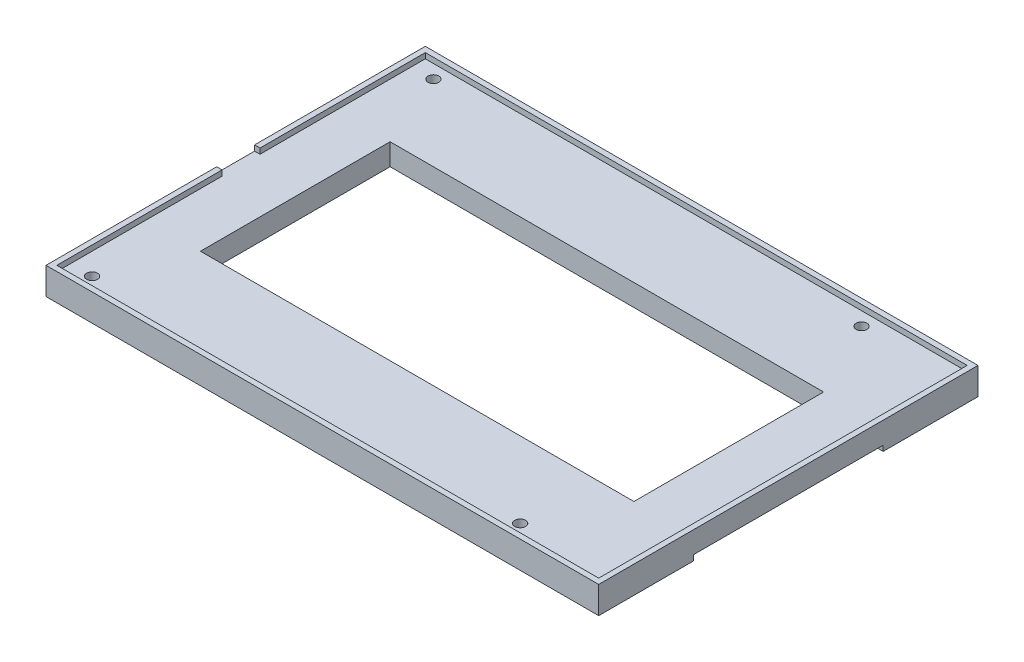
ISO-10303-21;
HEADER;
FILE_DESCRIPTION(('STEP AP214'),'2;1');
FILE_NAME('part.step','',(''),(''),'','','');
FILE_SCHEMA(('AUTOMOTIVE_DESIGN { 1 0 10303 214 1 1 1 1 }'));
ENDSEC;
DATA;
#1=APPLICATION_CONTEXT('core data for automotive mechanical design processes');
#2=APPLICATION_PROTOCOL_DEFINITION('international standard','automotive_design',2000,#1);
#3=PRODUCT_CONTEXT('',#1,'mechanical');
#4=PRODUCT('Part','Part','',(#3));
#5=PRODUCT_RELATED_PRODUCT_CATEGORY('part','',(#4));
#6=PRODUCT_DEFINITION_FORMATION('','',#4);
#7=PRODUCT_DEFINITION_CONTEXT('part definition',#1,'design');
#8=PRODUCT_DEFINITION('design','',#6,#7);
#9=PRODUCT_DEFINITION_SHAPE('','',#8);
#10=(LENGTH_UNIT() NAMED_UNIT(*) SI_UNIT(.MILLI.,.METRE.));
#11=(NAMED_UNIT(*) PLANE_ANGLE_UNIT() SI_UNIT($,.RADIAN.));
#12=(NAMED_UNIT(*) SI_UNIT($,.STERADIAN.) SOLID_ANGLE_UNIT());
#13=UNCERTAINTY_MEASURE_WITH_UNIT(LENGTH_MEASURE(1.E-05),#10,'distance_accuracy_value','');
#14=(GEOMETRIC_REPRESENTATION_CONTEXT(3) GLOBAL_UNCERTAINTY_ASSIGNED_CONTEXT((#13)) GLOBAL_UNIT_ASSIGNED_CONTEXT((#10,
#11,#12)) REPRESENTATION_CONTEXT('',''));
#15=CARTESIAN_POINT('',(0.,0.,0.));
#16=DIRECTION('',(0.,0.,1.));
#17=DIRECTION('',(1.,0.,0.));
#18=AXIS2_PLACEMENT_3D('',#15,#16,#17);
#19=CARTESIAN_POINT('',(40.,5.,17.5));
#20=DIRECTION('',(1.,0.,0.));
#21=DIRECTION('',(0.,0.,-1.));
#22=AXIS2_PLACEMENT_3D('',#19,#20,#21);
#23=PLANE('',#22);
#24=DIRECTION('',(0.,0.,1.));
#25=VECTOR('',#24,1.);
#26=CARTESIAN_POINT('',(40.,4.,17.5));
#27=LINE('',#26,#25);
#28=CARTESIAN_POINT('',(40.,4.,-17.5));
#29=VERTEX_POINT('',#28);
#30=CARTESIAN_POINT('',(40.,4.,17.5));
#31=VERTEX_POINT('',#30);
#32=EDGE_CURVE('E211',#29,#31,#27,.T.);
#33=ORIENTED_EDGE('',*,*,#32,.F.);
#34=DIRECTION('',(0.,-1.,0.));
#35=VECTOR('',#34,1.);
#36=CARTESIAN_POINT('',(40.,5.,-17.5));
#37=LINE('',#36,#35);
#38=CARTESIAN_POINT('',(40.,1.,-17.5));
#39=VERTEX_POINT('',#38);
#40=EDGE_CURVE('E59',#29,#39,#37,.T.);
#41=ORIENTED_EDGE('',*,*,#40,.T.);
#42=DIRECTION('',(0.,0.,-1.));
#43=VECTOR('',#42,1.);
#44=CARTESIAN_POINT('',(40.,1.,17.5));
#45=LINE('',#44,#43);
#46=CARTESIAN_POINT('',(40.,1.,17.5));
#47=VERTEX_POINT('',#46);
#48=EDGE_CURVE('E232',#47,#39,#45,.T.);
#49=ORIENTED_EDGE('',*,*,#48,.F.);
#50=DIRECTION('',(0.,-1.,0.));
#51=VECTOR('',#50,1.);
#52=CARTESIAN_POINT('',(40.,5.,17.5));
#53=LINE('',#52,#51);
#54=EDGE_CURVE('E260',#31,#47,#53,.T.);
#55=ORIENTED_EDGE('',*,*,#54,.F.);
#56=EDGE_LOOP('',(#33,#41,#49,#55));
#57=FACE_BOUND('',#56,.T.);
#58=ADVANCED_FACE('F37',(#57),#23,.F.);
#59=CARTESIAN_POINT('',(-40.,5.,17.5));
#60=DIRECTION('',(-1.,0.,0.));
#61=DIRECTION('',(0.,0.,1.));
#62=AXIS2_PLACEMENT_3D('',#59,#60,#61);
#63=PLANE('',#62);
#64=DIRECTION('',(0.,0.,-1.));
#65=VECTOR('',#64,1.);
#66=CARTESIAN_POINT('',(-40.,4.,17.5));
#67=LINE('',#66,#65);
#68=CARTESIAN_POINT('',(-40.,4.,17.5));
#69=VERTEX_POINT('',#68);
#70=CARTESIAN_POINT('',(-40.,4.,-17.5));
#71=VERTEX_POINT('',#70);
#72=EDGE_CURVE('E51',#69,#71,#67,.T.);
#73=ORIENTED_EDGE('',*,*,#72,.F.);
#74=DIRECTION('',(0.,-1.,0.));
#75=VECTOR('',#74,1.);
#76=CARTESIAN_POINT('',(-40.,5.,17.5));
#77=LINE('',#76,#75);
#78=CARTESIAN_POINT('',(-40.,0.,17.5));
#79=VERTEX_POINT('',#78);
#80=EDGE_CURVE('E257',#69,#79,#77,.T.);
#81=ORIENTED_EDGE('',*,*,#80,.T.);
#82=DIRECTION('',(0.,0.,-1.));
#83=VECTOR('',#82,1.);
#84=CARTESIAN_POINT('',(-40.,0.,17.5));
#85=LINE('',#84,#83);
#86=CARTESIAN_POINT('',(-40.,0.,-17.5));
#87=VERTEX_POINT('',#86);
#88=EDGE_CURVE('E246',#79,#87,#85,.T.);
#89=ORIENTED_EDGE('',*,*,#88,.T.);
#90=DIRECTION('',(0.,-1.,0.));
#91=VECTOR('',#90,1.);
#92=CARTESIAN_POINT('',(-40.,5.,-17.5));
#93=LINE('',#92,#91);
#94=EDGE_CURVE('E256',#71,#87,#93,.T.);
#95=ORIENTED_EDGE('',*,*,#94,.F.);
#96=EDGE_LOOP('',(#73,#81,#89,#95));
#97=FACE_BOUND('',#96,.T.);
#98=ADVANCED_FACE('F376',(#97),#63,.F.);
#99=CARTESIAN_POINT('',(-40.,5.,17.5));
#100=DIRECTION('',(0.,0.,1.));
#101=DIRECTION('',(1.,0.,0.));
#102=AXIS2_PLACEMENT_3D('',#99,#100,#101);
#103=PLANE('',#102);
#104=DIRECTION('',(-1.,0.,0.));
#105=VECTOR('',#104,1.);
#106=CARTESIAN_POINT('',(-40.,4.,17.5));
#107=LINE('',#106,#105);
#108=EDGE_CURVE('E213',#31,#69,#107,.T.);
#109=ORIENTED_EDGE('',*,*,#108,.F.);
#110=ORIENTED_EDGE('',*,*,#54,.T.);
#111=DIRECTION('',(-1.,0.,0.));
#112=VECTOR('',#111,1.);
#113=CARTESIAN_POINT('',(40.,1.,17.5));
#114=LINE('',#113,#112);
#115=CARTESIAN_POINT('',(51.,1.,17.5));
#116=VERTEX_POINT('',#115);
#117=EDGE_CURVE('E239',#116,#47,#114,.T.);
#118=ORIENTED_EDGE('',*,*,#117,.F.);
#119=DIRECTION('',(0.,-1.,0.));
#120=VECTOR('',#119,1.);
#121=CARTESIAN_POINT('',(51.,1.,17.5));
#122=LINE('',#121,#120);
#123=CARTESIAN_POINT('',(51.,0.,17.5));
#124=VERTEX_POINT('',#123);
#125=EDGE_CURVE('E243',#116,#124,#122,.T.);
#126=ORIENTED_EDGE('',*,*,#125,.T.);
#127=DIRECTION('',(-1.,0.,0.));
#128=VECTOR('',#127,1.);
#129=CARTESIAN_POINT('',(-40.,0.,17.5));
#130=LINE('',#129,#128);
#131=EDGE_CURVE('E253',#124,#79,#130,.T.);
#132=ORIENTED_EDGE('',*,*,#131,.T.);
#133=ORIENTED_EDGE('',*,*,#80,.F.);
#134=EDGE_LOOP('',(#109,#110,#118,#126,#132,#133));
#135=FACE_BOUND('',#134,.T.);
#136=ADVANCED_FACE('F381',(#135),#103,.F.);
#137=CARTESIAN_POINT('',(-40.,5.,-17.5));
#138=DIRECTION('',(0.,0.,-1.));
#139=DIRECTION('',(-1.,0.,0.));
#140=AXIS2_PLACEMENT_3D('',#137,#138,#139);
#141=PLANE('',#140);
#142=DIRECTION('',(1.,0.,0.));
#143=VECTOR('',#142,1.);
#144=CARTESIAN_POINT('',(-40.,4.,-17.5));
#145=LINE('',#144,#143);
#146=EDGE_CURVE('E11',#71,#29,#145,.T.);
#147=ORIENTED_EDGE('',*,*,#146,.F.);
#148=ORIENTED_EDGE('',*,*,#94,.T.);
#149=DIRECTION('',(1.,0.,0.));
#150=VECTOR('',#149,1.);
#151=CARTESIAN_POINT('',(-40.,0.,-17.5));
#152=LINE('',#151,#150);
#153=CARTESIAN_POINT('',(51.,0.,-17.5));
#154=VERTEX_POINT('',#153);
#155=EDGE_CURVE('E251',#87,#154,#152,.T.);
#156=ORIENTED_EDGE('',*,*,#155,.T.);
#157=DIRECTION('',(0.,-1.,0.));
#158=VECTOR('',#157,1.);
#159=CARTESIAN_POINT('',(51.,1.,-17.5));
#160=LINE('',#159,#158);
#161=CARTESIAN_POINT('',(51.,1.,-17.5));
#162=VERTEX_POINT('',#161);
#163=EDGE_CURVE('E242',#162,#154,#160,.T.);
#164=ORIENTED_EDGE('',*,*,#163,.F.);
#165=DIRECTION('',(1.,0.,0.));
#166=VECTOR('',#165,1.);
#167=CARTESIAN_POINT('',(40.,1.,-17.5));
#168=LINE('',#167,#166);
#169=EDGE_CURVE('E234',#39,#162,#168,.T.);
#170=ORIENTED_EDGE('',*,*,#169,.F.);
#171=ORIENTED_EDGE('',*,*,#40,.F.);
#172=EDGE_LOOP('',(#147,#148,#156,#164,#170,#171));
#173=FACE_BOUND('',#172,.T.);
#174=ADVANCED_FACE('F387',(#173),#141,.F.);
#175=CARTESIAN_POINT('',(-51.,5.,35.));
#176=DIRECTION('',(1.,0.,0.));
#177=DIRECTION('',(0.,0.,-1.));
#178=AXIS2_PLACEMENT_3D('',#175,#176,#177);
#179=PLANE('',#178);
#180=DIRECTION('',(0.,0.,1.));
#181=VECTOR('',#180,1.);
#182=CARTESIAN_POINT('',(-51.,4.,-3.5));
#183=LINE('',#182,#181);
#184=CARTESIAN_POINT('',(-51.,4.,-3.5));
#185=VERTEX_POINT('',#184);
#186=CARTESIAN_POINT('',(-51.,4.,3.5));
#187=VERTEX_POINT('',#186);
#188=EDGE_CURVE('E266',#185,#187,#183,.T.);
#189=ORIENTED_EDGE('',*,*,#188,.F.);
#190=DIRECTION('',(0.,-1.,0.));
#191=VECTOR('',#190,1.);
#192=CARTESIAN_POINT('',(-51.,5.,-3.5));
#193=LINE('',#192,#191);
#194=CARTESIAN_POINT('',(-51.,5.,-3.5));
#195=VERTEX_POINT('',#194);
#196=EDGE_CURVE('E259',#195,#185,#193,.T.);
#197=ORIENTED_EDGE('',*,*,#196,.F.);
#198=DIRECTION('',(0.,0.,1.));
#199=VECTOR('',#198,1.);
#200=CARTESIAN_POINT('',(-51.,5.,35.));
#201=LINE('',#200,#199);
#202=CARTESIAN_POINT('',(-51.,5.,-35.));
#203=VERTEX_POINT('',#202);
#204=EDGE_CURVE('E291',#203,#195,#201,.T.);
#205=ORIENTED_EDGE('',*,*,#204,.F.);
#206=DIRECTION('',(0.,-1.,0.));
#207=VECTOR('',#206,1.);
#208=CARTESIAN_POINT('',(-51.,5.,-35.));
#209=LINE('',#208,#207);
#210=CARTESIAN_POINT('',(-51.,0.,-35.));
#211=VERTEX_POINT('',#210);
#212=EDGE_CURVE('E301',#203,#211,#209,.T.);
#213=ORIENTED_EDGE('',*,*,#212,.T.);
#214=DIRECTION('',(0.,0.,1.));
#215=VECTOR('',#214,1.);
#216=CARTESIAN_POINT('',(-51.,0.,35.));
#217=LINE('',#216,#215);
#218=CARTESIAN_POINT('',(-51.,0.,35.));
#219=VERTEX_POINT('',#218);
#220=EDGE_CURVE('E290',#211,#219,#217,.T.);
#221=ORIENTED_EDGE('',*,*,#220,.T.);
#222=DIRECTION('',(0.,-1.,0.));
#223=VECTOR('',#222,1.);
#224=CARTESIAN_POINT('',(-51.,5.,35.));
#225=LINE('',#224,#223);
#226=CARTESIAN_POINT('',(-51.,5.,35.));
#227=VERTEX_POINT('',#226);
#228=EDGE_CURVE('E45',#227,#219,#225,.T.);
#229=ORIENTED_EDGE('',*,*,#228,.F.);
#230=CARTESIAN_POINT('',(-51.,5.,3.5));
#231=VERTEX_POINT('',#230);
#232=EDGE_CURVE('E295',#231,#227,#201,.T.);
#233=ORIENTED_EDGE('',*,*,#232,.F.);
#234=DIRECTION('',(0.,1.,0.));
#235=VECTOR('',#234,1.);
#236=CARTESIAN_POINT('',(-51.,5.,3.5));
#237=LINE('',#236,#235);
#238=EDGE_CURVE('E268',#187,#231,#237,.T.);
#239=ORIENTED_EDGE('',*,*,#238,.F.);
#240=EDGE_LOOP('',(#189,#197,#205,#213,#221,#229,#233,#239));
#241=FACE_BOUND('',#240,.T.);
#242=ADVANCED_FACE('F39',(#241),#179,.F.);
#243=CARTESIAN_POINT('',(51.,5.,35.));
#244=DIRECTION('',(0.,0.,-1.));
#245=DIRECTION('',(-1.,0.,0.));
#246=AXIS2_PLACEMENT_3D('',#243,#244,#245);
#247=PLANE('',#246);
#248=DIRECTION('',(1.,0.,0.));
#249=VECTOR('',#248,1.);
#250=CARTESIAN_POINT('',(51.,0.,35.));
#251=LINE('',#250,#249);
#252=CARTESIAN_POINT('',(51.,0.,35.));
#253=VERTEX_POINT('',#252);
#254=EDGE_CURVE('E304',#219,#253,#251,.T.);
#255=ORIENTED_EDGE('',*,*,#254,.T.);
#256=DIRECTION('',(0.,-1.,0.));
#257=VECTOR('',#256,1.);
#258=CARTESIAN_POINT('',(51.,5.,35.));
#259=LINE('',#258,#257);
#260=CARTESIAN_POINT('',(51.,5.,35.));
#261=VERTEX_POINT('',#260);
#262=EDGE_CURVE('E317',#261,#253,#259,.T.);
#263=ORIENTED_EDGE('',*,*,#262,.F.);
#264=DIRECTION('',(1.,0.,0.));
#265=VECTOR('',#264,1.);
#266=CARTESIAN_POINT('',(51.,5.,35.));
#267=LINE('',#266,#265);
#268=EDGE_CURVE('E294',#227,#261,#267,.T.);
#269=ORIENTED_EDGE('',*,*,#268,.F.);
#270=ORIENTED_EDGE('',*,*,#228,.T.);
#271=EDGE_LOOP('',(#255,#263,#269,#270));
#272=FACE_BOUND('',#271,.T.);
#273=ADVANCED_FACE('F323',(#272),#247,.F.);
#274=CARTESIAN_POINT('',(51.,5.,35.));
#275=DIRECTION('',(-1.,0.,0.));
#276=DIRECTION('',(0.,0.,1.));
#277=AXIS2_PLACEMENT_3D('',#274,#275,#276);
#278=PLANE('',#277);
#279=DIRECTION('',(0.,0.,-1.));
#280=VECTOR('',#279,1.);
#281=CARTESIAN_POINT('',(51.,0.,35.));
#282=LINE('',#281,#280);
#283=EDGE_CURVE('E307',#253,#124,#282,.T.);
#284=ORIENTED_EDGE('',*,*,#283,.T.);
#285=ORIENTED_EDGE('',*,*,#125,.F.);
#286=DIRECTION('',(0.,0.,1.));
#287=VECTOR('',#286,1.);
#288=CARTESIAN_POINT('',(51.,1.,17.5));
#289=LINE('',#288,#287);
#290=EDGE_CURVE('E237',#162,#116,#289,.T.);
#291=ORIENTED_EDGE('',*,*,#290,.F.);
#292=ORIENTED_EDGE('',*,*,#163,.T.);
#293=CARTESIAN_POINT('',(51.,0.,-35.));
#294=VERTEX_POINT('',#293);
#295=EDGE_CURVE('E306',#154,#294,#282,.T.);
#296=ORIENTED_EDGE('',*,*,#295,.T.);
#297=DIRECTION('',(0.,-1.,0.));
#298=VECTOR('',#297,1.);
#299=CARTESIAN_POINT('',(51.,5.,-35.));
#300=LINE('',#299,#298);
#301=CARTESIAN_POINT('',(51.,5.,-35.));
#302=VERTEX_POINT('',#301);
#303=EDGE_CURVE('E314',#302,#294,#300,.T.);
#304=ORIENTED_EDGE('',*,*,#303,.F.);
#305=DIRECTION('',(0.,0.,-1.));
#306=VECTOR('',#305,1.);
#307=CARTESIAN_POINT('',(51.,5.,35.));
#308=LINE('',#307,#306);
#309=EDGE_CURVE('E297',#261,#302,#308,.T.);
#310=ORIENTED_EDGE('',*,*,#309,.F.);
#311=ORIENTED_EDGE('',*,*,#262,.T.);
#312=EDGE_LOOP('',(#284,#285,#291,#292,#296,#304,#310,#311));
#313=FACE_BOUND('',#312,.T.);
#314=ADVANCED_FACE('F339',(#313),#278,.F.);
#315=CARTESIAN_POINT('',(51.,5.,-35.));
#316=DIRECTION('',(0.,0.,1.));
#317=DIRECTION('',(1.,0.,0.));
#318=AXIS2_PLACEMENT_3D('',#315,#316,#317);
#319=PLANE('',#318);
#320=DIRECTION('',(-1.,0.,0.));
#321=VECTOR('',#320,1.);
#322=CARTESIAN_POINT('',(51.,0.,-35.));
#323=LINE('',#322,#321);
#324=EDGE_CURVE('E310',#294,#211,#323,.T.);
#325=ORIENTED_EDGE('',*,*,#324,.T.);
#326=ORIENTED_EDGE('',*,*,#212,.F.);
#327=DIRECTION('',(-1.,0.,0.));
#328=VECTOR('',#327,1.);
#329=CARTESIAN_POINT('',(51.,5.,-35.));
#330=LINE('',#329,#328);
#331=EDGE_CURVE('E299',#302,#203,#330,.T.);
#332=ORIENTED_EDGE('',*,*,#331,.F.);
#333=ORIENTED_EDGE('',*,*,#303,.T.);
#334=EDGE_LOOP('',(#325,#326,#332,#333));
#335=FACE_BOUND('',#334,.T.);
#336=ADVANCED_FACE('F431',(#335),#319,.F.);
#337=CARTESIAN_POINT('',(0.,5.,0.));
#338=DIRECTION('',(0.,1.,0.));
#339=DIRECTION('',(0.,0.,1.));
#340=AXIS2_PLACEMENT_3D('',#337,#338,#339);
#341=PLANE('',#340);
#342=DIRECTION('',(0.,0.,1.));
#343=VECTOR('',#342,1.);
#344=CARTESIAN_POINT('',(-50.,5.,-34.));
#345=LINE('',#344,#343);
#346=CARTESIAN_POINT('',(-50.,5.,-34.));
#347=VERTEX_POINT('',#346);
#348=CARTESIAN_POINT('',(-50.,5.,-3.5));
#349=VERTEX_POINT('',#348);
#350=EDGE_CURVE('E196',#347,#349,#345,.T.);
#351=ORIENTED_EDGE('',*,*,#350,.F.);
#352=DIRECTION('',(-1.,0.,0.));
#353=VECTOR('',#352,1.);
#354=CARTESIAN_POINT('',(-50.,5.,-34.));
#355=LINE('',#354,#353);
#356=CARTESIAN_POINT('',(50.,5.,-34.));
#357=VERTEX_POINT('',#356);
#358=EDGE_CURVE('E175',#357,#347,#355,.T.);
#359=ORIENTED_EDGE('',*,*,#358,.F.);
#360=DIRECTION('',(0.,0.,-1.));
#361=VECTOR('',#360,1.);
#362=CARTESIAN_POINT('',(50.,5.,-34.));
#363=LINE('',#362,#361);
#364=CARTESIAN_POINT('',(50.,5.,34.));
#365=VERTEX_POINT('',#364);
#366=EDGE_CURVE('E200',#365,#357,#363,.T.);
#367=ORIENTED_EDGE('',*,*,#366,.F.);
#368=DIRECTION('',(1.,0.,0.));
#369=VECTOR('',#368,1.);
#370=CARTESIAN_POINT('',(-50.,5.,34.));
#371=LINE('',#370,#369);
#372=CARTESIAN_POINT('',(-50.,5.,34.));
#373=VERTEX_POINT('',#372);
#374=EDGE_CURVE('E198',#373,#365,#371,.T.);
#375=ORIENTED_EDGE('',*,*,#374,.F.);
#376=CARTESIAN_POINT('',(-50.,5.,3.5));
#377=VERTEX_POINT('',#376);
#378=EDGE_CURVE('E181',#377,#373,#345,.T.);
#379=ORIENTED_EDGE('',*,*,#378,.F.);
#380=DIRECTION('',(-1.,0.,0.));
#381=VECTOR('',#380,1.);
#382=CARTESIAN_POINT('',(-49.,5.,3.5));
#383=LINE('',#382,#381);
#384=EDGE_CURVE('E275',#377,#231,#383,.T.);
#385=ORIENTED_EDGE('',*,*,#384,.T.);
#386=ORIENTED_EDGE('',*,*,#232,.T.);
#387=ORIENTED_EDGE('',*,*,#268,.T.);
#388=ORIENTED_EDGE('',*,*,#309,.T.);
#389=ORIENTED_EDGE('',*,*,#331,.T.);
#390=ORIENTED_EDGE('',*,*,#204,.T.);
#391=DIRECTION('',(-1.,0.,0.));
#392=VECTOR('',#391,1.);
#393=CARTESIAN_POINT('',(-49.,5.,-3.5));
#394=LINE('',#393,#392);
#395=EDGE_CURVE('E272',#349,#195,#394,.T.);
#396=ORIENTED_EDGE('',*,*,#395,.F.);
#397=EDGE_LOOP('',(#351,#359,#367,#375,#379,#385,#386,#387,#388,#389,#390,#396));
#398=FACE_BOUND('',#397,.T.);
#399=ADVANCED_FACE('F346',(#398),#341,.T.);
#400=CARTESIAN_POINT('',(0.,0.,0.));
#401=DIRECTION('',(0.,1.,0.));
#402=DIRECTION('',(0.,0.,1.));
#403=AXIS2_PLACEMENT_3D('',#400,#401,#402);
#404=PLANE('',#403);
#405=ORIENTED_EDGE('',*,*,#131,.F.);
#406=ORIENTED_EDGE('',*,*,#283,.F.);
#407=ORIENTED_EDGE('',*,*,#254,.F.);
#408=ORIENTED_EDGE('',*,*,#220,.F.);
#409=ORIENTED_EDGE('',*,*,#324,.F.);
#410=ORIENTED_EDGE('',*,*,#295,.F.);
#411=ORIENTED_EDGE('',*,*,#155,.F.);
#412=ORIENTED_EDGE('',*,*,#88,.F.);
#413=EDGE_LOOP('',(#405,#406,#407,#408,#409,#410,#411,#412));
#414=FACE_BOUND('',#413,.T.);
#415=ADVANCED_FACE('F333',(#414),#404,.F.);
#416=CARTESIAN_POINT('',(-49.,5.,-3.5));
#417=DIRECTION('',(0.,0.,-1.));
#418=DIRECTION('',(0.,1.,0.));
#419=AXIS2_PLACEMENT_3D('',#416,#417,#418);
#420=PLANE('',#419);
#421=DIRECTION('',(-1.,0.,0.));
#422=VECTOR('',#421,1.);
#423=CARTESIAN_POINT('',(-49.,4.,-3.5));
#424=LINE('',#423,#422);
#425=CARTESIAN_POINT('',(-50.,4.,-3.5));
#426=VERTEX_POINT('',#425);
#427=EDGE_CURVE('E271',#426,#185,#424,.T.);
#428=ORIENTED_EDGE('',*,*,#427,.F.);
#429=DIRECTION('',(0.,1.,0.));
#430=VECTOR('',#429,1.);
#431=CARTESIAN_POINT('',(-50.,5.,-3.5));
#432=LINE('',#431,#430);
#433=EDGE_CURVE('E229',#426,#349,#432,.T.);
#434=ORIENTED_EDGE('',*,*,#433,.T.);
#435=ORIENTED_EDGE('',*,*,#395,.T.);
#436=ORIENTED_EDGE('',*,*,#196,.T.);
#437=EDGE_LOOP('',(#428,#434,#435,#436));
#438=FACE_BOUND('',#437,.T.);
#439=ADVANCED_FACE('F355',(#438),#420,.F.);
#440=CARTESIAN_POINT('',(-49.,5.,3.5));
#441=DIRECTION('',(0.,0.,1.));
#442=DIRECTION('',(1.,0.,0.));
#443=AXIS2_PLACEMENT_3D('',#440,#441,#442);
#444=PLANE('',#443);
#445=ORIENTED_EDGE('',*,*,#384,.F.);
#446=DIRECTION('',(0.,-1.,0.));
#447=VECTOR('',#446,1.);
#448=CARTESIAN_POINT('',(-50.,5.,3.5));
#449=LINE('',#448,#447);
#450=CARTESIAN_POINT('',(-50.,4.,3.5));
#451=VERTEX_POINT('',#450);
#452=EDGE_CURVE('E227',#377,#451,#449,.T.);
#453=ORIENTED_EDGE('',*,*,#452,.T.);
#454=DIRECTION('',(-1.,0.,0.));
#455=VECTOR('',#454,1.);
#456=CARTESIAN_POINT('',(-49.,4.,3.5));
#457=LINE('',#456,#455);
#458=EDGE_CURVE('E171',#451,#187,#457,.T.);
#459=ORIENTED_EDGE('',*,*,#458,.T.);
#460=ORIENTED_EDGE('',*,*,#238,.T.);
#461=EDGE_LOOP('',(#445,#453,#459,#460));
#462=FACE_BOUND('',#461,.T.);
#463=ADVANCED_FACE('F351',(#462),#444,.F.);
#464=CARTESIAN_POINT('',(-49.,4.,-3.5));
#465=DIRECTION('',(0.,-1.,0.));
#466=DIRECTION('',(0.,0.,-1.));
#467=AXIS2_PLACEMENT_3D('',#464,#465,#466);
#468=PLANE('',#467);
#469=DIRECTION('',(0.,0.,1.));
#470=VECTOR('',#469,1.);
#471=CARTESIAN_POINT('',(-50.,4.,-34.));
#472=LINE('',#471,#470);
#473=CARTESIAN_POINT('',(-50.,4.,-34.));
#474=VERTEX_POINT('',#473);
#475=EDGE_CURVE('E174',#474,#426,#472,.T.);
#476=ORIENTED_EDGE('',*,*,#475,.T.);
#477=ORIENTED_EDGE('',*,*,#427,.T.);
#478=ORIENTED_EDGE('',*,*,#188,.T.);
#479=ORIENTED_EDGE('',*,*,#458,.F.);
#480=CARTESIAN_POINT('',(-50.,4.,34.));
#481=VERTEX_POINT('',#480);
#482=EDGE_CURVE('E163',#451,#481,#472,.T.);
#483=ORIENTED_EDGE('',*,*,#482,.T.);
#484=DIRECTION('',(1.,0.,0.));
#485=VECTOR('',#484,1.);
#486=CARTESIAN_POINT('',(-50.,4.,34.));
#487=LINE('',#486,#485);
#488=CARTESIAN_POINT('',(50.,4.,34.));
#489=VERTEX_POINT('',#488);
#490=EDGE_CURVE('E169',#481,#489,#487,.T.);
#491=ORIENTED_EDGE('',*,*,#490,.T.);
#492=DIRECTION('',(0.,0.,-1.));
#493=VECTOR('',#492,1.);
#494=CARTESIAN_POINT('',(50.,4.,-34.));
#495=LINE('',#494,#493);
#496=CARTESIAN_POINT('',(50.,4.,-34.));
#497=VERTEX_POINT('',#496);
#498=EDGE_CURVE('E190',#489,#497,#495,.T.);
#499=ORIENTED_EDGE('',*,*,#498,.T.);
#500=DIRECTION('',(-1.,0.,0.));
#501=VECTOR('',#500,1.);
#502=CARTESIAN_POINT('',(-50.,4.,-34.));
#503=LINE('',#502,#501);
#504=EDGE_CURVE('E186',#497,#474,#503,.T.);
#505=ORIENTED_EDGE('',*,*,#504,.T.);
#506=EDGE_LOOP('',(#476,#477,#478,#479,#483,#491,#499,#505));
#507=FACE_BOUND('',#506,.T.);
#508=ORIENTED_EDGE('',*,*,#108,.T.);
#509=ORIENTED_EDGE('',*,*,#72,.T.);
#510=ORIENTED_EDGE('',*,*,#146,.T.);
#511=ORIENTED_EDGE('',*,*,#32,.T.);
#512=EDGE_LOOP('',(#508,#509,#510,#511));
#513=FACE_BOUND('',#512,.T.);
#514=CARTESIAN_POINT('',(-46.,4.,31.5));
#515=DIRECTION('',(0.,1.,0.));
#516=DIRECTION('',(0.,0.,1.));
#517=AXIS2_PLACEMENT_3D('',#514,#515,#516);
#518=CIRCLE('',#517,0.999999999999998);
#519=CARTESIAN_POINT('',(-46.,4.,32.5));
#520=VERTEX_POINT('',#519);
#521=EDGE_CURVE('E215',#520,#520,#518,.F.);
#522=ORIENTED_EDGE('',*,*,#521,.T.);
#523=EDGE_LOOP('',(#522));
#524=FACE_BOUND('',#523,.T.);
#525=CARTESIAN_POINT('',(33.,4.,31.5));
#526=DIRECTION('',(0.,1.,0.));
#527=DIRECTION('',(0.,0.,1.));
#528=AXIS2_PLACEMENT_3D('',#525,#526,#527);
#529=CIRCLE('',#528,0.999999999999998);
#530=CARTESIAN_POINT('',(33.,4.,32.5));
#531=VERTEX_POINT('',#530);
#532=EDGE_CURVE('E218',#531,#531,#529,.F.);
#533=ORIENTED_EDGE('',*,*,#532,.T.);
#534=EDGE_LOOP('',(#533));
#535=FACE_BOUND('',#534,.T.);
#536=CARTESIAN_POINT('',(-46.,4.,-31.5));
#537=DIRECTION('',(0.,1.,0.));
#538=DIRECTION('',(0.,0.,1.));
#539=AXIS2_PLACEMENT_3D('',#536,#537,#538);
#540=CIRCLE('',#539,0.999999999999998);
#541=CARTESIAN_POINT('',(-46.,4.,-30.5));
#542=VERTEX_POINT('',#541);
#543=EDGE_CURVE('E221',#542,#542,#540,.F.);
#544=ORIENTED_EDGE('',*,*,#543,.T.);
#545=EDGE_LOOP('',(#544));
#546=FACE_BOUND('',#545,.T.);
#547=CARTESIAN_POINT('',(33.,4.,-31.5));
#548=DIRECTION('',(0.,1.,0.));
#549=DIRECTION('',(0.,0.,1.));
#550=AXIS2_PLACEMENT_3D('',#547,#548,#549);
#551=CIRCLE('',#550,0.999999999999998);
#552=CARTESIAN_POINT('',(33.,4.,-30.5));
#553=VERTEX_POINT('',#552);
#554=EDGE_CURVE('E224',#553,#553,#551,.F.);
#555=ORIENTED_EDGE('',*,*,#554,.T.);
#556=EDGE_LOOP('',(#555));
#557=FACE_BOUND('',#556,.T.);
#558=ADVANCED_FACE('F166',(#507,#513,#524,#535,#546,#557),#468,.F.);
#559=CARTESIAN_POINT('',(0.,1.,0.));
#560=DIRECTION('',(0.,-1.,0.));
#561=DIRECTION('',(0.,0.,-1.));
#562=AXIS2_PLACEMENT_3D('',#559,#560,#561);
#563=PLANE('',#562);
#564=ORIENTED_EDGE('',*,*,#48,.T.);
#565=ORIENTED_EDGE('',*,*,#169,.T.);
#566=ORIENTED_EDGE('',*,*,#290,.T.);
#567=ORIENTED_EDGE('',*,*,#117,.T.);
#568=EDGE_LOOP('',(#564,#565,#566,#567));
#569=FACE_BOUND('',#568,.T.);
#570=ADVANCED_FACE('F395',(#569),#563,.T.);
#571=CARTESIAN_POINT('',(-50.,4.,-34.));
#572=DIRECTION('',(-1.,0.,0.));
#573=DIRECTION('',(0.,0.,1.));
#574=AXIS2_PLACEMENT_3D('',#571,#572,#573);
#575=PLANE('',#574);
#576=ORIENTED_EDGE('',*,*,#475,.F.);
#577=DIRECTION('',(0.,1.,0.));
#578=VECTOR('',#577,1.);
#579=CARTESIAN_POINT('',(-50.,4.,-34.));
#580=LINE('',#579,#578);
#581=EDGE_CURVE('E205',#474,#347,#580,.T.);
#582=ORIENTED_EDGE('',*,*,#581,.T.);
#583=ORIENTED_EDGE('',*,*,#350,.T.);
#584=ORIENTED_EDGE('',*,*,#433,.F.);
#585=EDGE_LOOP('',(#576,#582,#583,#584));
#586=FACE_BOUND('',#585,.T.);
#587=ADVANCED_FACE('F360',(#586),#575,.F.);
#588=ORIENTED_EDGE('',*,*,#378,.T.);
#589=DIRECTION('',(0.,1.,0.));
#590=VECTOR('',#589,1.);
#591=CARTESIAN_POINT('',(-50.,4.,34.));
#592=LINE('',#591,#590);
#593=EDGE_CURVE('E178',#481,#373,#592,.T.);
#594=ORIENTED_EDGE('',*,*,#593,.F.);
#595=ORIENTED_EDGE('',*,*,#482,.F.);
#596=ORIENTED_EDGE('',*,*,#452,.F.);
#597=EDGE_LOOP('',(#588,#594,#595,#596));
#598=FACE_BOUND('',#597,.T.);
#599=ADVANCED_FACE('F179',(#598),#575,.F.);
#600=CARTESIAN_POINT('',(-50.,4.,-34.));
#601=DIRECTION('',(0.,0.,-1.));
#602=DIRECTION('',(-1.,0.,0.));
#603=AXIS2_PLACEMENT_3D('',#600,#601,#602);
#604=PLANE('',#603);
#605=ORIENTED_EDGE('',*,*,#358,.T.);
#606=ORIENTED_EDGE('',*,*,#581,.F.);
#607=ORIENTED_EDGE('',*,*,#504,.F.);
#608=DIRECTION('',(0.,1.,0.));
#609=VECTOR('',#608,1.);
#610=CARTESIAN_POINT('',(50.,4.,-34.));
#611=LINE('',#610,#609);
#612=EDGE_CURVE('E207',#497,#357,#611,.T.);
#613=ORIENTED_EDGE('',*,*,#612,.T.);
#614=EDGE_LOOP('',(#605,#606,#607,#613));
#615=FACE_BOUND('',#614,.T.);
#616=ADVANCED_FACE('F363',(#615),#604,.F.);
#617=CARTESIAN_POINT('',(50.,4.,-34.));
#618=DIRECTION('',(1.,0.,0.));
#619=DIRECTION('',(0.,0.,-1.));
#620=AXIS2_PLACEMENT_3D('',#617,#618,#619);
#621=PLANE('',#620);
#622=ORIENTED_EDGE('',*,*,#366,.T.);
#623=ORIENTED_EDGE('',*,*,#612,.F.);
#624=ORIENTED_EDGE('',*,*,#498,.F.);
#625=DIRECTION('',(0.,1.,0.));
#626=VECTOR('',#625,1.);
#627=CARTESIAN_POINT('',(50.,4.,34.));
#628=LINE('',#627,#626);
#629=EDGE_CURVE('E185',#489,#365,#628,.T.);
#630=ORIENTED_EDGE('',*,*,#629,.T.);
#631=EDGE_LOOP('',(#622,#623,#624,#630));
#632=FACE_BOUND('',#631,.T.);
#633=ADVANCED_FACE('F365',(#632),#621,.F.);
#634=CARTESIAN_POINT('',(-50.,4.,34.));
#635=DIRECTION('',(0.,0.,1.));
#636=DIRECTION('',(1.,0.,0.));
#637=AXIS2_PLACEMENT_3D('',#634,#635,#636);
#638=PLANE('',#637);
#639=ORIENTED_EDGE('',*,*,#374,.T.);
#640=ORIENTED_EDGE('',*,*,#629,.F.);
#641=ORIENTED_EDGE('',*,*,#490,.F.);
#642=ORIENTED_EDGE('',*,*,#593,.T.);
#643=EDGE_LOOP('',(#639,#640,#641,#642));
#644=FACE_BOUND('',#643,.T.);
#645=ADVANCED_FACE('F188',(#644),#638,.F.);
#646=CARTESIAN_POINT('',(-46.,0.5,31.5));
#647=DIRECTION('',(0.,-1.,0.));
#648=DIRECTION('',(0.,0.,-1.));
#649=AXIS2_PLACEMENT_3D('',#646,#647,#648);
#650=PLANE('',#649);
#651=CARTESIAN_POINT('',(-46.,0.5,31.5));
#652=DIRECTION('',(0.,1.,0.));
#653=DIRECTION('',(0.,0.,-1.));
#654=AXIS2_PLACEMENT_3D('',#651,#652,#653);
#655=CIRCLE('',#654,0.999999999999998);
#656=CARTESIAN_POINT('',(-46.,0.5,30.5));
#657=VERTEX_POINT('',#656);
#658=EDGE_CURVE('E274',#657,#657,#655,.T.);
#659=ORIENTED_EDGE('',*,*,#658,.T.);
#660=EDGE_LOOP('',(#659));
#661=FACE_BOUND('',#660,.T.);
#662=ADVANCED_FACE('F372',(#661),#650,.F.);
#663=CARTESIAN_POINT('',(-46.,0.5,31.5));
#664=DIRECTION('',(0.,1.,0.));
#665=DIRECTION('',(0.,0.,1.));
#666=AXIS2_PLACEMENT_3D('',#663,#664,#665);
#667=CYLINDRICAL_SURFACE('',#666,0.999999999999998);
#668=ORIENTED_EDGE('',*,*,#658,.F.);
#669=EDGE_LOOP('',(#668));
#670=FACE_BOUND('',#669,.T.);
#671=ORIENTED_EDGE('',*,*,#521,.F.);
#672=EDGE_LOOP('',(#671));
#673=FACE_BOUND('',#672,.T.);
#674=ADVANCED_FACE('F400',(#670,#673),#667,.F.);
#675=CARTESIAN_POINT('',(33.,0.5,31.5));
#676=DIRECTION('',(0.,1.,0.));
#677=DIRECTION('',(0.,0.,1.));
#678=AXIS2_PLACEMENT_3D('',#675,#676,#677);
#679=PLANE('',#678);
#680=CARTESIAN_POINT('',(33.,0.5,31.5));
#681=DIRECTION('',(0.,1.,0.));
#682=DIRECTION('',(0.,0.,1.));
#683=AXIS2_PLACEMENT_3D('',#680,#681,#682);
#684=CIRCLE('',#683,0.999999999999998);
#685=CARTESIAN_POINT('',(33.,0.5,32.5));
#686=VERTEX_POINT('',#685);
#687=EDGE_CURVE('E281',#686,#686,#684,.T.);
#688=ORIENTED_EDGE('',*,*,#687,.T.);
#689=EDGE_LOOP('',(#688));
#690=FACE_BOUND('',#689,.T.);
#691=ADVANCED_FACE('F404',(#690),#679,.T.);
#692=CARTESIAN_POINT('',(33.,0.5,31.5));
#693=DIRECTION('',(0.,1.,0.));
#694=DIRECTION('',(0.,0.,1.));
#695=AXIS2_PLACEMENT_3D('',#692,#693,#694);
#696=CYLINDRICAL_SURFACE('',#695,0.999999999999998);
#697=ORIENTED_EDGE('',*,*,#687,.F.);
#698=EDGE_LOOP('',(#697));
#699=FACE_BOUND('',#698,.T.);
#700=ORIENTED_EDGE('',*,*,#532,.F.);
#701=EDGE_LOOP('',(#700));
#702=FACE_BOUND('',#701,.T.);
#703=ADVANCED_FACE('F408',(#699,#702),#696,.F.);
#704=CARTESIAN_POINT('',(-46.,0.5,-31.5));
#705=DIRECTION('',(0.,1.,0.));
#706=DIRECTION('',(0.,0.,1.));
#707=AXIS2_PLACEMENT_3D('',#704,#705,#706);
#708=PLANE('',#707);
#709=CARTESIAN_POINT('',(-46.,0.5,-31.5));
#710=DIRECTION('',(0.,1.,0.));
#711=DIRECTION('',(0.,0.,1.));
#712=AXIS2_PLACEMENT_3D('',#709,#710,#711);
#713=CIRCLE('',#712,0.999999999999998);
#714=CARTESIAN_POINT('',(-46.,0.5,-30.5));
#715=VERTEX_POINT('',#714);
#716=EDGE_CURVE('E284',#715,#715,#713,.T.);
#717=ORIENTED_EDGE('',*,*,#716,.T.);
#718=EDGE_LOOP('',(#717));
#719=FACE_BOUND('',#718,.T.);
#720=ADVANCED_FACE('F412',(#719),#708,.T.);
#721=CARTESIAN_POINT('',(-46.,0.5,-31.5));
#722=DIRECTION('',(0.,1.,0.));
#723=DIRECTION('',(0.,0.,1.));
#724=AXIS2_PLACEMENT_3D('',#721,#722,#723);
#725=CYLINDRICAL_SURFACE('',#724,0.999999999999998);
#726=ORIENTED_EDGE('',*,*,#716,.F.);
#727=EDGE_LOOP('',(#726));
#728=FACE_BOUND('',#727,.T.);
#729=ORIENTED_EDGE('',*,*,#543,.F.);
#730=EDGE_LOOP('',(#729));
#731=FACE_BOUND('',#730,.T.);
#732=ADVANCED_FACE('F416',(#728,#731),#725,.F.);
#733=CARTESIAN_POINT('',(33.,0.5,-31.5));
#734=DIRECTION('',(0.,-1.,0.));
#735=DIRECTION('',(0.,0.,-1.));
#736=AXIS2_PLACEMENT_3D('',#733,#734,#735);
#737=PLANE('',#736);
#738=CARTESIAN_POINT('',(33.,0.5,-31.5));
#739=DIRECTION('',(0.,1.,0.));
#740=DIRECTION('',(0.,0.,-1.));
#741=AXIS2_PLACEMENT_3D('',#738,#739,#740);
#742=CIRCLE('',#741,0.999999999999998);
#743=CARTESIAN_POINT('',(33.,0.5,-32.5));
#744=VERTEX_POINT('',#743);
#745=EDGE_CURVE('E287',#744,#744,#742,.T.);
#746=ORIENTED_EDGE('',*,*,#745,.T.);
#747=EDGE_LOOP('',(#746));
#748=FACE_BOUND('',#747,.T.);
#749=ADVANCED_FACE('F420',(#748),#737,.F.);
#750=CARTESIAN_POINT('',(33.,0.5,-31.5));
#751=DIRECTION('',(0.,1.,0.));
#752=DIRECTION('',(0.,0.,1.));
#753=AXIS2_PLACEMENT_3D('',#750,#751,#752);
#754=CYLINDRICAL_SURFACE('',#753,0.999999999999998);
#755=ORIENTED_EDGE('',*,*,#745,.F.);
#756=EDGE_LOOP('',(#755));
#757=FACE_BOUND('',#756,.T.);
#758=ORIENTED_EDGE('',*,*,#554,.F.);
#759=EDGE_LOOP('',(#758));
#760=FACE_BOUND('',#759,.T.);
#761=ADVANCED_FACE('F424',(#757,#760),#754,.F.);
#762=CLOSED_SHELL('',(#58,#98,#136,#174,#242,#273,#314,#336,#399,#415,#439,#463,#558,#570,#587,
#599,#616,#633,#645,#662,#674,#691,#703,#720,#732,#749,#761));
#763=MANIFOLD_SOLID_BREP('B2',#762);
#764=ADVANCED_BREP_SHAPE_REPRESENTATION('',(#18,#763),#14);
#765=SHAPE_DEFINITION_REPRESENTATION(#9,#764);
ENDSEC;
END-ISO-10303-21;
